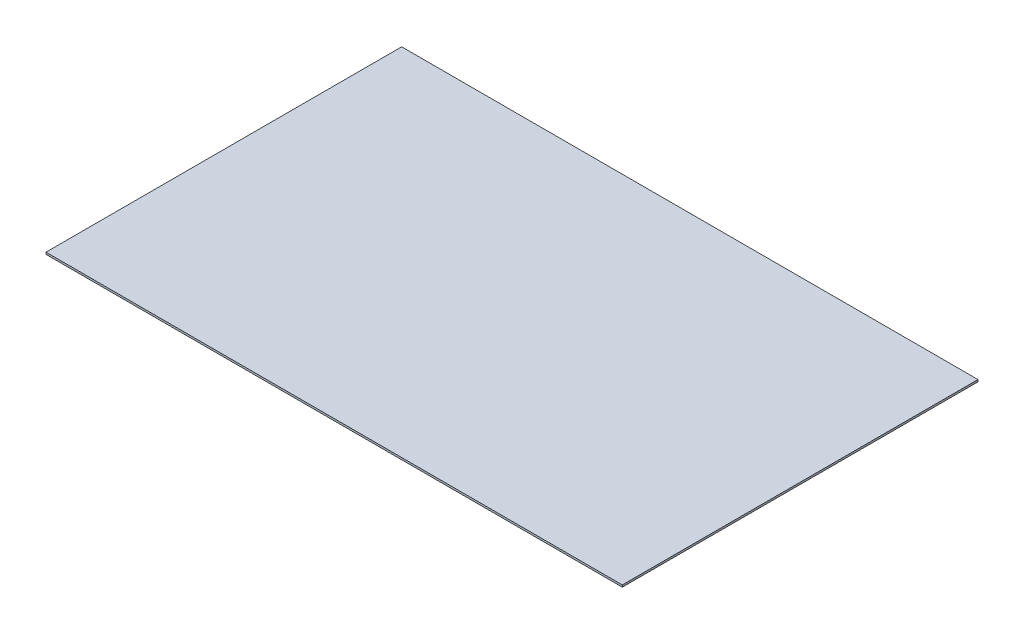
ISO-10303-21;
HEADER;
FILE_DESCRIPTION(('STEP AP214'),'2;1');
FILE_NAME('part.step','',(''),(''),'','','');
FILE_SCHEMA(('AUTOMOTIVE_DESIGN { 1 0 10303 214 1 1 1 1 }'));
ENDSEC;
DATA;
#1=APPLICATION_CONTEXT('core data for automotive mechanical design processes');
#2=APPLICATION_PROTOCOL_DEFINITION('international standard','automotive_design',2000,#1);
#3=PRODUCT_CONTEXT('',#1,'mechanical');
#4=PRODUCT('Part','Part','',(#3));
#5=PRODUCT_RELATED_PRODUCT_CATEGORY('part','',(#4));
#6=PRODUCT_DEFINITION_FORMATION('','',#4);
#7=PRODUCT_DEFINITION_CONTEXT('part definition',#1,'design');
#8=PRODUCT_DEFINITION('design','',#6,#7);
#9=PRODUCT_DEFINITION_SHAPE('','',#8);
#10=(LENGTH_UNIT() NAMED_UNIT(*) SI_UNIT(.MILLI.,.METRE.));
#11=(NAMED_UNIT(*) PLANE_ANGLE_UNIT() SI_UNIT($,.RADIAN.));
#12=(NAMED_UNIT(*) SI_UNIT($,.STERADIAN.) SOLID_ANGLE_UNIT());
#13=UNCERTAINTY_MEASURE_WITH_UNIT(LENGTH_MEASURE(1.E-05),#10,'distance_accuracy_value','');
#14=(GEOMETRIC_REPRESENTATION_CONTEXT(3) GLOBAL_UNCERTAINTY_ASSIGNED_CONTEXT((#13)) GLOBAL_UNIT_ASSIGNED_CONTEXT((#10,
#11,#12)) REPRESENTATION_CONTEXT('',''));
#15=CARTESIAN_POINT('',(0.,0.,0.));
#16=DIRECTION('',(0.,0.,1.));
#17=DIRECTION('',(1.,0.,0.));
#18=AXIS2_PLACEMENT_3D('',#15,#16,#17);
#19=CARTESIAN_POINT('',(-437.5,3.,-270.000000000006));
#20=DIRECTION('',(1.,0.,0.));
#21=DIRECTION('',(0.,0.,-1.));
#22=AXIS2_PLACEMENT_3D('',#19,#20,#21);
#23=PLANE('',#22);
#24=DIRECTION('',(0.,0.,1.));
#25=VECTOR('',#24,1.);
#26=CARTESIAN_POINT('',(-437.5,0.,-270.000000000006));
#27=LINE('',#26,#25);
#28=CARTESIAN_POINT('',(-437.5,0.,-270.000000000006));
#29=VERTEX_POINT('',#28);
#30=CARTESIAN_POINT('',(-437.5,0.,270.000000000006));
#31=VERTEX_POINT('',#30);
#32=EDGE_CURVE('E96',#29,#31,#27,.T.);
#33=ORIENTED_EDGE('',*,*,#32,.T.);
#34=DIRECTION('',(0.,-1.,0.));
#35=VECTOR('',#34,1.);
#36=CARTESIAN_POINT('',(-437.5,3.,270.000000000006));
#37=LINE('',#36,#35);
#38=CARTESIAN_POINT('',(-437.5,3.,270.000000000006));
#39=VERTEX_POINT('',#38);
#40=EDGE_CURVE('E11',#39,#31,#37,.T.);
#41=ORIENTED_EDGE('',*,*,#40,.F.);
#42=DIRECTION('',(0.,0.,1.));
#43=VECTOR('',#42,1.);
#44=CARTESIAN_POINT('',(-437.5,3.,-270.000000000006));
#45=LINE('',#44,#43);
#46=CARTESIAN_POINT('',(-437.5,3.,-270.000000000006));
#47=VERTEX_POINT('',#46);
#48=EDGE_CURVE('E84',#47,#39,#45,.T.);
#49=ORIENTED_EDGE('',*,*,#48,.F.);
#50=DIRECTION('',(0.,-1.,0.));
#51=VECTOR('',#50,1.);
#52=CARTESIAN_POINT('',(-437.5,3.,-270.000000000006));
#53=LINE('',#52,#51);
#54=EDGE_CURVE('E92',#47,#29,#53,.T.);
#55=ORIENTED_EDGE('',*,*,#54,.T.);
#56=EDGE_LOOP('',(#33,#41,#49,#55));
#57=FACE_BOUND('',#56,.T.);
#58=ADVANCED_FACE('F33',(#57),#23,.F.);
#59=CARTESIAN_POINT('',(-437.5,3.,270.000000000006));
#60=DIRECTION('',(0.,0.,-1.));
#61=DIRECTION('',(-1.,0.,0.));
#62=AXIS2_PLACEMENT_3D('',#59,#60,#61);
#63=PLANE('',#62);
#64=DIRECTION('',(1.,0.,0.));
#65=VECTOR('',#64,1.);
#66=CARTESIAN_POINT('',(-437.5,0.,270.000000000006));
#67=LINE('',#66,#65);
#68=CARTESIAN_POINT('',(437.5,0.,270.000000000006));
#69=VERTEX_POINT('',#68);
#70=EDGE_CURVE('E88',#31,#69,#67,.T.);
#71=ORIENTED_EDGE('',*,*,#70,.T.);
#72=DIRECTION('',(0.,-1.,0.));
#73=VECTOR('',#72,1.);
#74=CARTESIAN_POINT('',(437.5,3.,270.000000000006));
#75=LINE('',#74,#73);
#76=CARTESIAN_POINT('',(437.5,3.,270.000000000006));
#77=VERTEX_POINT('',#76);
#78=EDGE_CURVE('E41',#77,#69,#75,.T.);
#79=ORIENTED_EDGE('',*,*,#78,.F.);
#80=DIRECTION('',(1.,0.,0.));
#81=VECTOR('',#80,1.);
#82=CARTESIAN_POINT('',(-437.5,3.,270.000000000006));
#83=LINE('',#82,#81);
#84=EDGE_CURVE('E79',#39,#77,#83,.T.);
#85=ORIENTED_EDGE('',*,*,#84,.F.);
#86=ORIENTED_EDGE('',*,*,#40,.T.);
#87=EDGE_LOOP('',(#71,#79,#85,#86));
#88=FACE_BOUND('',#87,.T.);
#89=ADVANCED_FACE('F87',(#88),#63,.F.);
#90=CARTESIAN_POINT('',(437.5,3.,-270.000000000006));
#91=DIRECTION('',(-1.,0.,0.));
#92=DIRECTION('',(0.,0.,1.));
#93=AXIS2_PLACEMENT_3D('',#90,#91,#92);
#94=PLANE('',#93);
#95=DIRECTION('',(0.,0.,-1.));
#96=VECTOR('',#95,1.);
#97=CARTESIAN_POINT('',(437.5,0.,-270.000000000006));
#98=LINE('',#97,#96);
#99=CARTESIAN_POINT('',(437.5,0.,-270.000000000006));
#100=VERTEX_POINT('',#99);
#101=EDGE_CURVE('E66',#69,#100,#98,.T.);
#102=ORIENTED_EDGE('',*,*,#101,.T.);
#103=DIRECTION('',(0.,-1.,0.));
#104=VECTOR('',#103,1.);
#105=CARTESIAN_POINT('',(437.5,3.,-270.000000000006));
#106=LINE('',#105,#104);
#107=CARTESIAN_POINT('',(437.5,3.,-270.000000000006));
#108=VERTEX_POINT('',#107);
#109=EDGE_CURVE('E89',#108,#100,#106,.T.);
#110=ORIENTED_EDGE('',*,*,#109,.F.);
#111=DIRECTION('',(0.,0.,-1.));
#112=VECTOR('',#111,1.);
#113=CARTESIAN_POINT('',(437.5,3.,-270.000000000006));
#114=LINE('',#113,#112);
#115=EDGE_CURVE('E82',#77,#108,#114,.T.);
#116=ORIENTED_EDGE('',*,*,#115,.F.);
#117=ORIENTED_EDGE('',*,*,#78,.T.);
#118=EDGE_LOOP('',(#102,#110,#116,#117));
#119=FACE_BOUND('',#118,.T.);
#120=ADVANCED_FACE('F90',(#119),#94,.F.);
#121=CARTESIAN_POINT('',(-437.5,3.,-270.000000000006));
#122=DIRECTION('',(0.,0.,1.));
#123=DIRECTION('',(1.,0.,0.));
#124=AXIS2_PLACEMENT_3D('',#121,#122,#123);
#125=PLANE('',#124);
#126=DIRECTION('',(-1.,0.,0.));
#127=VECTOR('',#126,1.);
#128=CARTESIAN_POINT('',(-437.5,0.,-270.000000000006));
#129=LINE('',#128,#127);
#130=EDGE_CURVE('E72',#100,#29,#129,.T.);
#131=ORIENTED_EDGE('',*,*,#130,.T.);
#132=ORIENTED_EDGE('',*,*,#54,.F.);
#133=DIRECTION('',(-1.,0.,0.));
#134=VECTOR('',#133,1.);
#135=CARTESIAN_POINT('',(-437.5,3.,-270.000000000006));
#136=LINE('',#135,#134);
#137=EDGE_CURVE('E49',#108,#47,#136,.T.);
#138=ORIENTED_EDGE('',*,*,#137,.F.);
#139=ORIENTED_EDGE('',*,*,#109,.T.);
#140=EDGE_LOOP('',(#131,#132,#138,#139));
#141=FACE_BOUND('',#140,.T.);
#142=ADVANCED_FACE('F103',(#141),#125,.F.);
#143=CARTESIAN_POINT('',(0.,3.,0.));
#144=DIRECTION('',(0.,1.,0.));
#145=DIRECTION('',(0.,0.,1.));
#146=AXIS2_PLACEMENT_3D('',#143,#144,#145);
#147=PLANE('',#146);
#148=ORIENTED_EDGE('',*,*,#48,.T.);
#149=ORIENTED_EDGE('',*,*,#84,.T.);
#150=ORIENTED_EDGE('',*,*,#115,.T.);
#151=ORIENTED_EDGE('',*,*,#137,.T.);
#152=EDGE_LOOP('',(#148,#149,#150,#151));
#153=FACE_BOUND('',#152,.T.);
#154=ADVANCED_FACE('F80',(#153),#147,.T.);
#155=CARTESIAN_POINT('',(0.,0.,0.));
#156=DIRECTION('',(0.,1.,0.));
#157=DIRECTION('',(0.,0.,1.));
#158=AXIS2_PLACEMENT_3D('',#155,#156,#157);
#159=PLANE('',#158);
#160=ORIENTED_EDGE('',*,*,#32,.F.);
#161=ORIENTED_EDGE('',*,*,#130,.F.);
#162=ORIENTED_EDGE('',*,*,#101,.F.);
#163=ORIENTED_EDGE('',*,*,#70,.F.);
#164=EDGE_LOOP('',(#160,#161,#162,#163));
#165=FACE_BOUND('',#164,.T.);
#166=ADVANCED_FACE('F106',(#165),#159,.F.);
#167=CLOSED_SHELL('',(#58,#89,#120,#142,#154,#166));
#168=MANIFOLD_SOLID_BREP('B2',#167);
#169=ADVANCED_BREP_SHAPE_REPRESENTATION('',(#18,#168),#14);
#170=SHAPE_DEFINITION_REPRESENTATION(#9,#169);
ENDSEC;
END-ISO-10303-21;
